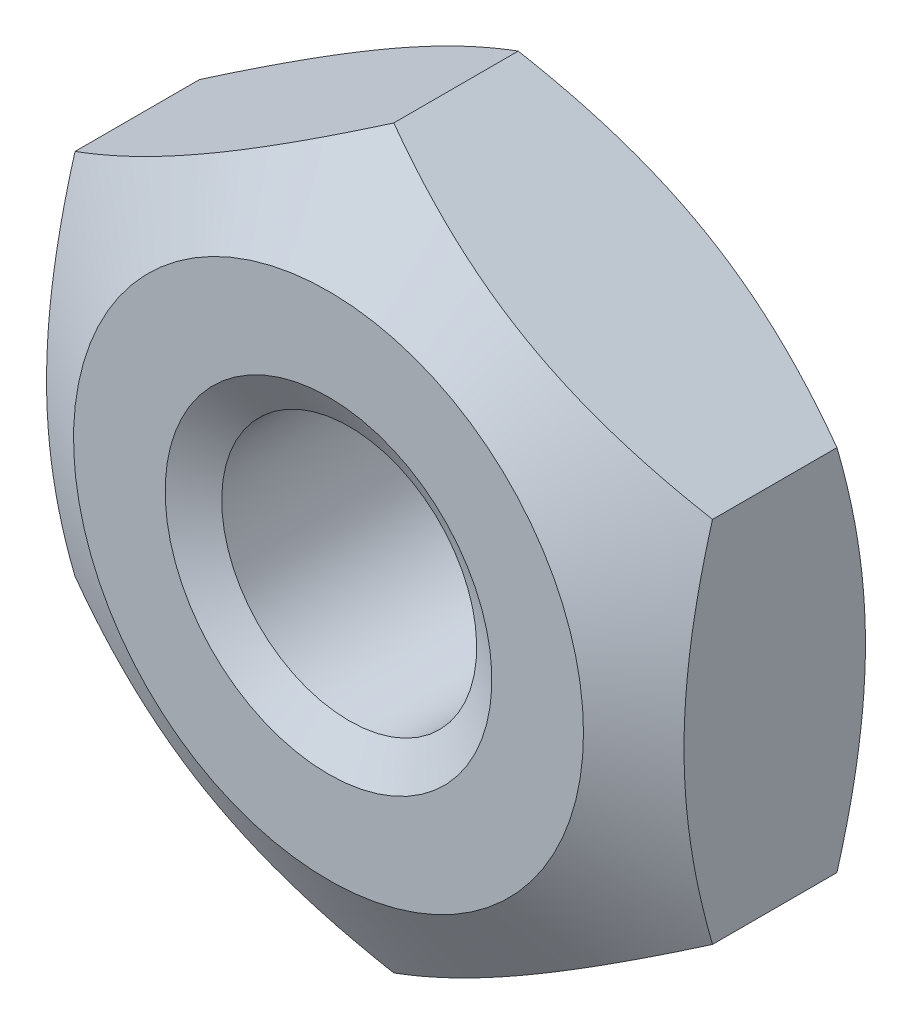
ISO-10303-21;
HEADER;
FILE_DESCRIPTION(('STEP AP214'),'2;1');
FILE_NAME('part.step','',(''),(''),'','','');
FILE_SCHEMA(('AUTOMOTIVE_DESIGN { 1 0 10303 214 1 1 1 1 }'));
ENDSEC;
DATA;
#1=APPLICATION_CONTEXT('core data for automotive mechanical design processes');
#2=APPLICATION_PROTOCOL_DEFINITION('international standard','automotive_design',2000,#1);
#3=PRODUCT_CONTEXT('',#1,'mechanical');
#4=PRODUCT('Part','Part','',(#3));
#5=PRODUCT_RELATED_PRODUCT_CATEGORY('part','',(#4));
#6=PRODUCT_DEFINITION_FORMATION('','',#4);
#7=PRODUCT_DEFINITION_CONTEXT('part definition',#1,'design');
#8=PRODUCT_DEFINITION('design','',#6,#7);
#9=PRODUCT_DEFINITION_SHAPE('','',#8);
#10=(LENGTH_UNIT() NAMED_UNIT(*) SI_UNIT(.MILLI.,.METRE.));
#11=(NAMED_UNIT(*) PLANE_ANGLE_UNIT() SI_UNIT($,.RADIAN.));
#12=(NAMED_UNIT(*) SI_UNIT($,.STERADIAN.) SOLID_ANGLE_UNIT());
#13=UNCERTAINTY_MEASURE_WITH_UNIT(LENGTH_MEASURE(1.E-05),#10,'distance_accuracy_value','');
#14=(GEOMETRIC_REPRESENTATION_CONTEXT(3) GLOBAL_UNCERTAINTY_ASSIGNED_CONTEXT((#13)) GLOBAL_UNIT_ASSIGNED_CONTEXT((#10,
#11,#12)) REPRESENTATION_CONTEXT('',''));
#15=CARTESIAN_POINT('',(0.,0.,0.));
#16=DIRECTION('',(0.,0.,1.));
#17=DIRECTION('',(1.,0.,0.));
#18=AXIS2_PLACEMENT_3D('',#15,#16,#17);
#19=CARTESIAN_POINT('',(0.,0.,0.));
#20=DIRECTION('',(0.,0.,1.));
#21=DIRECTION('',(1.,0.,0.));
#22=AXIS2_PLACEMENT_3D('',#19,#20,#21);
#23=PLANE('',#22);
#24=CARTESIAN_POINT('',(0.,0.,0.));
#25=DIRECTION('',(0.,0.,1.));
#26=DIRECTION('',(0.,-1.,0.));
#27=AXIS2_PLACEMENT_3D('',#24,#25,#26);
#28=CIRCLE('',#27,1.025);
#29=CARTESIAN_POINT('',(0.,-1.025,0.));
#30=VERTEX_POINT('',#29);
#31=EDGE_CURVE('E266',#30,#30,#28,.T.);
#32=ORIENTED_EDGE('',*,*,#31,.F.);
#33=EDGE_LOOP('',(#32));
#34=FACE_BOUND('',#33,.T.);
#35=CARTESIAN_POINT('',(0.,0.,0.));
#36=DIRECTION('',(0.,0.,1.));
#37=DIRECTION('',(1.,0.,0.));
#38=AXIS2_PLACEMENT_3D('',#35,#36,#37);
#39=CIRCLE('',#38,1.6);
#40=CARTESIAN_POINT('',(1.6,0.,0.));
#41=VERTEX_POINT('',#40);
#42=EDGE_CURVE('E225',#41,#41,#39,.T.);
#43=ORIENTED_EDGE('',*,*,#42,.T.);
#44=EDGE_LOOP('',(#43));
#45=FACE_BOUND('',#44,.T.);
#46=ADVANCED_FACE('F38',(#34,#45),#23,.T.);
#47=CARTESIAN_POINT('',(0.,0.,0.));
#48=DIRECTION('',(0.,0.,-1.));
#49=DIRECTION('',(-1.,0.,0.));
#50=AXIS2_PLACEMENT_3D('',#47,#48,#49);
#51=CONICAL_SURFACE('',#50,1.6,1.0471975511966);
#52=CARTESIAN_POINT('',(-2.0002,1.15458506832541,-0.409639574296354));
#53=CARTESIAN_POINT('',(-1.91230873709994,1.20532911262018,-0.380329643776534));
#54=CARTESIAN_POINT('',(-1.82365880552641,1.2565111744778,-0.353672959656322));
#55=CARTESIAN_POINT('',(-1.6448237530022,1.35976164019319,-0.307142598696575));
#56=CARTESIAN_POINT('',(-1.55463545349496,1.41183187919145,-0.287285384058633));
#57=CARTESIAN_POINT('',(-1.37537661423669,1.51532701829183,-0.256373571699106));
#58=CARTESIAN_POINT('',(-1.2863336617737,1.56673599086578,-0.245113259274384));
#59=CARTESIAN_POINT('',(-1.10782860221496,1.66979593505373,-0.231668770270495));
#60=CARTESIAN_POINT('',(-1.01836714429604,1.72144653186531,-0.229473462629321));
#61=CARTESIAN_POINT('',(-0.851191646451202,1.81796535054794,-0.234031097006501));
#62=CARTESIAN_POINT('',(-0.773452629734218,1.86284799277603,-0.239664982362867));
#63=CARTESIAN_POINT('',(-0.618481085463871,1.95232085557724,-0.25752400293668));
#64=CARTESIAN_POINT('',(-0.541249094258807,1.99691076648954,-0.269755243699291));
#65=CARTESIAN_POINT('',(-0.385957813517807,2.08656822922816,-0.30033354454346));
#66=CARTESIAN_POINT('',(-0.307918186892629,2.13162442866766,-0.318810274741566));
#67=CARTESIAN_POINT('',(-0.153003134307877,2.22106467597899,-0.360745625888705));
#68=CARTESIAN_POINT('',(-0.0761257223768926,2.26544987045195,-0.384194388168162));
#69=CARTESIAN_POINT('',(0.000199999999986211,2.30951654681233,-0.409639574296345));
#70=B_SPLINE_CURVE_WITH_KNOTS('',3,(#52,#53,#54,#55,#56,#57,#58,#59,#60,#61,#62,#63,#64,#65,#66,
#67,#68,#69),.UNSPECIFIED.,.F.,.F.,(4,2,2,2,2,2,2,2,4),(0.,0.317031824695611,0.634825876346565,
0.944753967652638,1.25430138000371,1.52387047293094,1.79368946861028,2.06949491027633,
2.34475850821471),.UNSPECIFIED.);
#71=CARTESIAN_POINT('',(-1.99999999999998,1.15470053837927,-0.409572902629929));
#72=VERTEX_POINT('',#71);
#73=CARTESIAN_POINT('',(0.,2.30940107675849,-0.409572902629929));
#74=VERTEX_POINT('',#73);
#75=EDGE_CURVE('E220',#72,#74,#70,.T.);
#76=ORIENTED_EDGE('',*,*,#75,.F.);
#77=CARTESIAN_POINT('',(-2.00000000000001,-3.03052049579594,-1.17258992769246));
#78=CARTESIAN_POINT('',(-2.00000000000001,-2.94372886764183,-1.13077950008363));
#79=CARTESIAN_POINT('',(-2.00000000000001,-2.85673015358734,-1.08939116564908));
#80=CARTESIAN_POINT('',(-2.00000000000001,-2.68220811235262,-1.00769767470967));
#81=CARTESIAN_POINT('',(-2.00000000000001,-2.59468469803299,-0.967392704581887));
#82=CARTESIAN_POINT('',(-2.00000000000001,-2.41851676018472,-0.887886673921365));
#83=CARTESIAN_POINT('',(-2.00000000000001,-2.32986867139882,-0.848693484344967));
#84=CARTESIAN_POINT('',(-2.00000000000001,-2.15184188257194,-0.772009478701173));
#85=CARTESIAN_POINT('',(-2.00000000000001,-2.06246321960079,-0.734518576883523));
#86=CARTESIAN_POINT('',(-2.00000000000001,-1.88025621442632,-0.660646333698944));
#87=CARTESIAN_POINT('',(-2.00000000000001,-1.78740237965157,-0.62432750922274));
#88=CARTESIAN_POINT('',(-2.00000000000001,-1.60058247531122,-0.554614987642539));
#89=CARTESIAN_POINT('',(-2.00000000000001,-1.50661627872517,-0.52122162832672));
#90=CARTESIAN_POINT('',(-2.00000000000001,-1.31762634984156,-0.458290489186248));
#91=CARTESIAN_POINT('',(-2.00000000000001,-1.22260551914203,-0.428744087391374));
#92=CARTESIAN_POINT('',(-2.00000000000001,-1.03119557452282,-0.374497165945702));
#93=CARTESIAN_POINT('',(-2.00000000000001,-0.93480680273185,-0.349795456744497));
#94=CARTESIAN_POINT('',(-2.00000000000001,-0.741128910384957,-0.306597964012984));
#95=CARTESIAN_POINT('',(-2.00000000000001,-0.643846716299778,-0.288071720447721));
#96=CARTESIAN_POINT('',(-2.00000000000001,-0.448151938907581,-0.258320606274393));
#97=CARTESIAN_POINT('',(-2.00000000000001,-0.349739441069647,-0.247095187258078));
#98=CARTESIAN_POINT('',(-2.00000000000001,-0.153525776620674,-0.232991739084162));
#99=CARTESIAN_POINT('',(-2.00000000000001,-0.0557321304576805,-0.230012064962078));
#100=CARTESIAN_POINT('',(-2.,0.13975003167291,-0.232377534118554));
#101=CARTESIAN_POINT('',(-2.,0.237438543103612,-0.237723023291434));
#102=CARTESIAN_POINT('',(-2.,0.476208665170388,-0.260491803794991));
#103=CARTESIAN_POINT('',(-2.,0.616874165871129,-0.282293659147515));
#104=CARTESIAN_POINT('',(-2.,0.895507734114708,-0.339146037610059));
#105=CARTESIAN_POINT('',(-2.,1.03347281625756,-0.374210439011915));
#106=CARTESIAN_POINT('',(-2.,1.30952391328072,-0.454685876034218));
#107=CARTESIAN_POINT('',(-2.,1.44754777586239,-0.500304636329477));
#108=CARTESIAN_POINT('',(-2.,1.7210514616477,-0.598359669184975));
#109=CARTESIAN_POINT('',(-2.,1.85653210717898,-0.650793693068427));
#110=CARTESIAN_POINT('',(-2.,2.16574275602154,-0.77673559227255));
#111=CARTESIAN_POINT('',(-2.,2.3388079813968,-0.851859482740154));
#112=CARTESIAN_POINT('',(-2.,2.6826712350005,-1.0071568330088));
#113=CARTESIAN_POINT('',(-2.,2.85346875200373,-1.08733140878092));
#114=CARTESIAN_POINT('',(-2.,3.1935873828221,-1.25111189286763));
#115=CARTESIAN_POINT('',(-2.,3.36290706964649,-1.33472075031524));
#116=CARTESIAN_POINT('',(-1.99999999999999,3.70037905202038,-1.50426422369798));
#117=CARTESIAN_POINT('',(-1.99999999999999,3.86853131311662,-1.59019890790976));
#118=CARTESIAN_POINT('',(-1.99999999999999,4.19077366360558,-1.75690437473475));
#119=CARTESIAN_POINT('',(-1.99999999999999,4.34492900543288,-1.8375493322588));
#120=CARTESIAN_POINT('',(-1.99999999999999,4.65268017325402,-1.99990916520772));
#121=CARTESIAN_POINT('',(-1.99999999999999,4.80627598293722,-2.0816240715081));
#122=CARTESIAN_POINT('',(-1.99999999999999,5.11269941410369,-2.24569846466231));
#123=CARTESIAN_POINT('',(-1.99999999999999,5.26552797617949,-2.3280561971989));
#124=CARTESIAN_POINT('',(-1.99999999999999,5.5708249923475,-2.49341950889133));
#125=CARTESIAN_POINT('',(-1.99999999999999,5.72329346315724,-2.57642505716979));
#126=CARTESIAN_POINT('',(-1.99999999999999,5.87562805658462,-2.6596739117175));
#127=B_SPLINE_CURVE_WITH_KNOTS('',3,(#77,#78,#79,#80,#81,#82,#83,#84,#85,#86,#87,#88,#89,#90,
#91,#92,#93,#94,#95,#96,#97,#98,#99,#100,#101,#102,#103,#104,#105,#106,#107,#108,#109,#110,#111,
#112,#113,#114,#115,#116,#117,#118,#119,#120,#121,#122,#123,#124,#125,#126),.UNSPECIFIED.,.F.,
.F.,(4,2,2,2,2,2,2,2,2,2,2,2,2,2,2,2,2,2,2,2,2,2,2,2,4),(0.,0.28901616240776,0.578081731674529,
0.868844523215953,1.15959265172095,1.45866666235963,1.75777516012266,2.05620129950673,
2.35455407229876,2.65141268040253,2.94824898711875,3.24140955046669,3.53458229438999,
3.96073507939292,4.38733504165973,4.82317840851069,5.25887833341065,5.82474273611492,
6.39073261058182,6.95721911942851,7.52372227605135,8.04564357517919,8.56757996873426,
9.08839905451368,9.60919346584464),.UNSPECIFIED.);
#128=CARTESIAN_POINT('',(-2.00000000000001,-1.15470053837921,-0.409572902629929));
#129=VERTEX_POINT('',#128);
#130=EDGE_CURVE('E188',#129,#72,#127,.T.);
#131=ORIENTED_EDGE('',*,*,#130,.F.);
#132=CARTESIAN_POINT('',(0.00019999999999125,-2.30951654681236,-0.409639574296361));
#133=CARTESIAN_POINT('',(-0.0876912629000694,-2.25877250251759,-0.380329643776542));
#134=CARTESIAN_POINT('',(-0.176341194473601,-2.20759044065997,-0.35367295965633));
#135=CARTESIAN_POINT('',(-0.355176246997814,-2.10433997494457,-0.307142598696584));
#136=CARTESIAN_POINT('',(-0.445364546505049,-2.05226973594632,-0.287285384058642));
#137=CARTESIAN_POINT('',(-0.62462338576332,-1.94877459684594,-0.256373571699115));
#138=CARTESIAN_POINT('',(-0.713666338226318,-1.89736562427198,-0.245113259274394));
#139=CARTESIAN_POINT('',(-0.892171397785059,-1.79430568008404,-0.231668770270505));
#140=CARTESIAN_POINT('',(-0.981632855703975,-1.74265508327245,-0.229473462629332));
#141=CARTESIAN_POINT('',(-1.14880835354881,-1.64613626458982,-0.234031097006513));
#142=CARTESIAN_POINT('',(-1.2265473702658,-1.60125362236174,-0.239664982362879));
#143=CARTESIAN_POINT('',(-1.38151891453615,-1.51178075956052,-0.257524002936693));
#144=CARTESIAN_POINT('',(-1.45875090574121,-1.46719084864822,-0.269755243699304));
#145=CARTESIAN_POINT('',(-1.61404218648221,-1.37753338590961,-0.300333544543474));
#146=CARTESIAN_POINT('',(-1.69208181310739,-1.3324771864701,-0.31881027474158));
#147=CARTESIAN_POINT('',(-1.84699686569214,-1.24303693915877,-0.360745625888719));
#148=CARTESIAN_POINT('',(-1.92387427762313,-1.19865174468581,-0.384194388168177));
#149=CARTESIAN_POINT('',(-2.00020000000001,-1.15458506832543,-0.409639574296361));
#150=B_SPLINE_CURVE_WITH_KNOTS('',3,(#132,#133,#134,#135,#136,#137,#138,#139,#140,#141,#142,
#143,#144,#145,#146,#147,#148,#149),.UNSPECIFIED.,.F.,.F.,(4,2,2,2,2,2,2,2,4),(0.,
0.317031824695612,0.634825876346569,0.944753967652643,1.25430138000372,1.52387047293095,
1.79368946861029,2.06949491027634,2.34475850821472),.UNSPECIFIED.);
#151=CARTESIAN_POINT('',(0.,-2.30940107675849,-0.409572902629929));
#152=VERTEX_POINT('',#151);
#153=EDGE_CURVE('E180',#152,#129,#150,.T.);
#154=ORIENTED_EDGE('',*,*,#153,.F.);
#155=CARTESIAN_POINT('',(2.00019999999999,-1.15458506832544,-0.409639574296353));
#156=CARTESIAN_POINT('',(1.91230873709993,-1.2053291126202,-0.380329643776534));
#157=CARTESIAN_POINT('',(1.8236588055264,-1.25651117447782,-0.353672959656322));
#158=CARTESIAN_POINT('',(1.64482375300218,-1.35976164019322,-0.307142598696577));
#159=CARTESIAN_POINT('',(1.55463545349495,-1.41183187919147,-0.287285384058635));
#160=CARTESIAN_POINT('',(1.37537661423668,-1.51532701829185,-0.25637357169911));
#161=CARTESIAN_POINT('',(1.28633366177368,-1.5667359908658,-0.245113259274389));
#162=CARTESIAN_POINT('',(1.10782860221494,-1.66979593505375,-0.231668770270501));
#163=CARTESIAN_POINT('',(1.01836714429603,-1.72144653186533,-0.229473462629327));
#164=CARTESIAN_POINT('',(0.851191646451187,-1.81796535054796,-0.234031097006509));
#165=CARTESIAN_POINT('',(0.773452629734202,-1.86284799277605,-0.239664982362876));
#166=CARTESIAN_POINT('',(0.618481085463853,-1.95232085557727,-0.25752400293669));
#167=CARTESIAN_POINT('',(0.541249094258789,-1.99691076648956,-0.269755243699302));
#168=CARTESIAN_POINT('',(0.385957813517788,-2.08656822922818,-0.300333544543473));
#169=CARTESIAN_POINT('',(0.307918186892609,-2.13162442866768,-0.318810274741579));
#170=CARTESIAN_POINT('',(0.153003134307855,-2.22106467597902,-0.360745625888719));
#171=CARTESIAN_POINT('',(0.0761257223768705,-2.26544987045197,-0.384194388168177));
#172=CARTESIAN_POINT('',(-0.000200000000009055,-2.30951654681236,-0.409639574296361));
#173=B_SPLINE_CURVE_WITH_KNOTS('',3,(#155,#156,#157,#158,#159,#160,#161,#162,#163,#164,#165,
#166,#167,#168,#169,#170,#171,#172),.UNSPECIFIED.,.F.,.F.,(4,2,2,2,2,2,2,2,4),(0.,
0.317031824695611,0.634825876346565,0.944753967652637,1.25430138000371,1.52387047293094,
1.79368946861028,2.06949491027633,2.34475850821472),.UNSPECIFIED.);
#174=CARTESIAN_POINT('',(1.99999999999997,-1.15470053837929,-0.409572902629929));
#175=VERTEX_POINT('',#174);
#176=EDGE_CURVE('E96',#175,#152,#173,.T.);
#177=ORIENTED_EDGE('',*,*,#176,.F.);
#178=CARTESIAN_POINT('',(1.99999999999999,-3.030520495734,-1.17258992766261));
#179=CARTESIAN_POINT('',(1.99999999999999,-2.94372886758197,-1.13077950005503));
#180=CARTESIAN_POINT('',(1.99999999999999,-2.85673015352955,-1.08939116562174));
#181=CARTESIAN_POINT('',(1.99999999999999,-2.68220811229899,-1.00769767468485));
#182=CARTESIAN_POINT('',(1.99999999999999,-2.59468469798146,-0.967392704558314));
#183=CARTESIAN_POINT('',(1.99999999999999,-2.41851676013738,-0.8878866739003));
#184=CARTESIAN_POINT('',(1.99999999999999,-2.32986867135361,-0.848693484325156));
#185=CARTESIAN_POINT('',(1.99999999999999,-2.15184188253098,-0.77200947868385));
#186=CARTESIAN_POINT('',(1.99999999999999,-2.06246321956197,-0.734518576867432));
#187=CARTESIAN_POINT('',(1.99999999999999,-1.88025621439191,-0.660646333685336));
#188=CARTESIAN_POINT('',(1.99999999999999,-1.78740237961943,-0.624327509210379));
#189=CARTESIAN_POINT('',(1.99999999999999,-1.60058247528366,-0.554614987632602));
#190=CARTESIAN_POINT('',(1.99999999999999,-1.50661627869992,-0.52122162831796));
#191=CARTESIAN_POINT('',(1.99999999999999,-1.31762634982097,-0.458290489179722));
#192=CARTESIAN_POINT('',(1.99999999999999,-1.2226055191238,-0.428744087385906));
#193=CARTESIAN_POINT('',(1.99999999999999,-1.03119557450936,-0.374497165942165));
#194=CARTESIAN_POINT('',(1.99999999999999,-0.934806802720806,-0.349795456741834));
#195=CARTESIAN_POINT('',(1.99999999999999,-0.741128910380068,-0.30659796401207));
#196=CARTESIAN_POINT('',(1.99999999999999,-0.643846716298643,-0.288071720447606));
#197=CARTESIAN_POINT('',(1.99999999999999,-0.448151938914037,-0.258320606275296));
#198=CARTESIAN_POINT('',(1.99999999999999,-0.349739441079938,-0.247095187259201));
#199=CARTESIAN_POINT('',(1.99999999999999,-0.153525776638568,-0.23299173908505));
#200=CARTESIAN_POINT('',(1.99999999999999,-0.0557321304793417,-0.230012064962521));
#201=CARTESIAN_POINT('',(1.99999999999999,0.139750031643783,-0.232377534117475));
#202=CARTESIAN_POINT('',(1.99999999999999,0.237438543070785,-0.237723023289277));
#203=CARTESIAN_POINT('',(1.99999999999999,0.476208665131639,-0.260491803789862));
#204=CARTESIAN_POINT('',(1.99999999999999,0.616874165830197,-0.282293659140565));
#205=CARTESIAN_POINT('',(1.99999999999999,0.895507734069557,-0.339146037599415));
#206=CARTESIAN_POINT('',(1.99999999999999,1.03347281621038,-0.374210438999399));
#207=CARTESIAN_POINT('',(1.99999999999999,1.30952391322944,-0.454685876017988));
#208=CARTESIAN_POINT('',(1.99999999999999,1.44754777580906,-0.500304636311406));
#209=CARTESIAN_POINT('',(1.99999999999999,1.72105146159028,-0.598359669163334));
#210=CARTESIAN_POINT('',(1.99999999999999,1.85653210711953,-0.650793693045057));
#211=CARTESIAN_POINT('',(1.99999999999999,2.16574275596061,-0.776735592246619));
#212=CARTESIAN_POINT('',(1.99999999999999,2.33880798133635,-0.85185948271357));
#213=CARTESIAN_POINT('',(1.99999999999999,2.68267123494092,-1.00715683298117));
#214=CARTESIAN_POINT('',(1.99999999999999,2.85346875194454,-1.0873314087529));
#215=CARTESIAN_POINT('',(1.99999999999999,3.19358738276363,-1.25111189283899));
#216=CARTESIAN_POINT('',(1.99999999999999,3.36290706958836,-1.33472075028637));
#217=CARTESIAN_POINT('',(1.99999999999999,3.70037905196287,-1.50426422366875));
#218=CARTESIAN_POINT('',(1.99999999999999,3.8685313130594,-1.5901989078804));
#219=CARTESIAN_POINT('',(1.99999999999999,4.19077366354868,-1.75690437470509));
#220=CARTESIAN_POINT('',(1.99999999999999,4.34492900537601,-1.83754933222897));
#221=CARTESIAN_POINT('',(1.99999999999999,4.6526801731972,-1.99990916517757));
#222=CARTESIAN_POINT('',(1.99999999999999,4.80627598288042,-2.08162407147781));
#223=CARTESIAN_POINT('',(1.99999999999999,5.11269941404687,-2.24569846463175));
#224=CARTESIAN_POINT('',(1.99999999999999,5.26552797612264,-2.32805619716821));
#225=CARTESIAN_POINT('',(1.99999999999999,5.57082499229059,-2.4934195088604));
#226=CARTESIAN_POINT('',(1.99999999999999,5.72329346310029,-2.57642505713875));
#227=CARTESIAN_POINT('',(1.99999999999999,5.87562805652763,-2.65967391168635));
#228=B_SPLINE_CURVE_WITH_KNOTS('',3,(#178,#179,#180,#181,#182,#183,#184,#185,#186,#187,#188,
#189,#190,#191,#192,#193,#194,#195,#196,#197,#198,#199,#200,#201,#202,#203,#204,#205,#206,#207,
#208,#209,#210,#211,#212,#213,#214,#215,#216,#217,#218,#219,#220,#221,#222,#223,#224,#225,#226,
#227),.UNSPECIFIED.,.F.,.F.,(4,2,2,2,2,2,2,2,2,2,2,2,2,2,2,2,2,2,2,2,2,2,2,2,4),(0.,
0.289016162400509,0.578081731660025,0.868844523194108,1.15959265169176,1.45866666232274,
1.75777516007806,2.05620129945445,2.3545540722388,2.65141268033109,2.94824898703584,
3.24140955037257,3.53458229428465,3.96073507928028,4.38733504153978,4.82317840838314,
5.25887833327554,5.82474273598035,6.39073261044779,6.95721911929508,7.52372227591852,
8.0456435750462,8.56757996860111,9.08839905438027,9.60919346571097),.UNSPECIFIED.);
#229=CARTESIAN_POINT('',(1.99999999999999,1.15470053837925,-0.409572902629929));
#230=VERTEX_POINT('',#229);
#231=EDGE_CURVE('E92',#230,#175,#228,.F.);
#232=ORIENTED_EDGE('',*,*,#231,.F.);
#233=CARTESIAN_POINT('',(-0.000200000000013959,2.30951654681233,-0.409639574296346));
#234=CARTESIAN_POINT('',(0.087691262900046,2.25877250251756,-0.380329643776527));
#235=CARTESIAN_POINT('',(0.176341194473577,2.20759044065994,-0.353672959656314));
#236=CARTESIAN_POINT('',(0.355176246997787,2.10433997494455,-0.307142598696568));
#237=CARTESIAN_POINT('',(0.445364546505021,2.05226973594629,-0.287285384058625));
#238=CARTESIAN_POINT('',(0.62462338576329,1.94877459684591,-0.256373571699098));
#239=CARTESIAN_POINT('',(0.713666338226288,1.89736562427196,-0.245113259274377));
#240=CARTESIAN_POINT('',(0.892171397785027,1.79430568008402,-0.231668770270487));
#241=CARTESIAN_POINT('',(0.981632855703941,1.74265508327244,-0.229473462629313));
#242=CARTESIAN_POINT('',(1.14880835354878,1.64613626458981,-0.234031097006494));
#243=CARTESIAN_POINT('',(1.22654737026577,1.60125362236172,-0.239664982362859));
#244=CARTESIAN_POINT('',(1.38151891453612,1.5117807595605,-0.257524002936673));
#245=CARTESIAN_POINT('',(1.45875090574118,1.46719084864821,-0.269755243699284));
#246=CARTESIAN_POINT('',(1.61404218648219,1.37753338590959,-0.300333544543455));
#247=CARTESIAN_POINT('',(1.69208181310737,1.33247718647008,-0.318810274741561));
#248=CARTESIAN_POINT('',(1.84699686569212,1.24303693915875,-0.360745625888702));
#249=CARTESIAN_POINT('',(1.92387427762311,1.19865174468579,-0.38419438816816));
#250=CARTESIAN_POINT('',(2.00019999999999,1.15458506832541,-0.409639574296345));
#251=B_SPLINE_CURVE_WITH_KNOTS('',3,(#233,#234,#235,#236,#237,#238,#239,#240,#241,#242,#243,
#244,#245,#246,#247,#248,#249,#250),.UNSPECIFIED.,.F.,.F.,(4,2,2,2,2,2,2,2,4),(0.,
0.317031824695609,0.634825876346561,0.944753967652632,1.25430138000371,1.52387047293093,
1.79368946861028,2.06949491027634,2.34475850821472),.UNSPECIFIED.);
#252=EDGE_CURVE('E64',#74,#230,#251,.T.);
#253=ORIENTED_EDGE('',*,*,#252,.F.);
#254=EDGE_LOOP('',(#76,#131,#154,#177,#232,#253));
#255=FACE_BOUND('',#254,.T.);
#256=ORIENTED_EDGE('',*,*,#42,.F.);
#257=EDGE_LOOP('',(#256));
#258=FACE_BOUND('',#257,.T.);
#259=ADVANCED_FACE('F93',(#255,#258),#51,.T.);
#260=CARTESIAN_POINT('',(1.99999999999999,1.15470053837925,-1.6));
#261=DIRECTION('',(0.499999999999998,0.86602540378444,0.));
#262=DIRECTION('',(-0.86602540378444,0.499999999999998,0.));
#263=AXIS2_PLACEMENT_3D('',#260,#261,#262);
#264=PLANE('',#263);
#265=DIRECTION('',(0.,0.,1.));
#266=VECTOR('',#265,1.);
#267=CARTESIAN_POINT('',(1.99999999999999,1.15470053837925,-1.6));
#268=LINE('',#267,#266);
#269=CARTESIAN_POINT('',(1.99999999999999,1.15470053837925,-1.19042709737007));
#270=VERTEX_POINT('',#269);
#271=EDGE_CURVE('E11',#270,#230,#268,.T.);
#272=ORIENTED_EDGE('',*,*,#271,.F.);
#273=CARTESIAN_POINT('',(2.00019999999999,1.15458506832541,-1.19036042570366));
#274=CARTESIAN_POINT('',(1.91230873709993,1.20532911262017,-1.21967035622347));
#275=CARTESIAN_POINT('',(1.8236588055264,1.25651117447779,-1.24632704034369));
#276=CARTESIAN_POINT('',(1.64482375300219,1.35976164019319,-1.29285740130343));
#277=CARTESIAN_POINT('',(1.55463545349495,1.41183187919144,-1.31271461594138));
#278=CARTESIAN_POINT('',(1.37537661423668,1.51532701829182,-1.3436264283009));
#279=CARTESIAN_POINT('',(1.28633366177369,1.56673599086577,-1.35488674072563));
#280=CARTESIAN_POINT('',(1.10782860221495,1.66979593505372,-1.36833122972951));
#281=CARTESIAN_POINT('',(1.01836714429603,1.7214465318653,-1.37052653737069));
#282=CARTESIAN_POINT('',(0.851191646451192,1.81796535054793,-1.36596890299351));
#283=CARTESIAN_POINT('',(0.773452629734206,1.86284799277602,-1.36033501763714));
#284=CARTESIAN_POINT('',(0.618481085463856,1.95232085557724,-1.34247599706333));
#285=CARTESIAN_POINT('',(0.54124909425879,1.99691076648953,-1.33024475630072));
#286=CARTESIAN_POINT('',(0.385957813517787,2.08656822922815,-1.29966645545655));
#287=CARTESIAN_POINT('',(0.307918186892608,2.13162442866766,-1.28118972525844));
#288=CARTESIAN_POINT('',(0.153003134307852,2.22106467597899,-1.2392543741113));
#289=CARTESIAN_POINT('',(0.0761257223768665,2.26544987045194,-1.21580561183184));
#290=CARTESIAN_POINT('',(-0.000200000000013659,2.30951654681233,-1.19036042570365));
#291=B_SPLINE_CURVE_WITH_KNOTS('',3,(#273,#274,#275,#276,#277,#278,#279,#280,#281,#282,#283,
#284,#285,#286,#287,#288,#289,#290),.UNSPECIFIED.,.F.,.F.,(4,2,2,2,2,2,2,2,4),(0.,
0.317031824695609,0.634825876346562,0.944753967652633,1.25430138000371,1.52387047293093,
1.79368946861028,2.06949491027634,2.34475850821472),.UNSPECIFIED.);
#292=CARTESIAN_POINT('',(0.,2.30940107675849,-1.19042709737007));
#293=VERTEX_POINT('',#292);
#294=EDGE_CURVE('E112',#270,#293,#291,.T.);
#295=ORIENTED_EDGE('',*,*,#294,.T.);
#296=DIRECTION('',(0.,0.,1.));
#297=VECTOR('',#296,1.);
#298=CARTESIAN_POINT('',(0.,2.30940107675849,-1.6));
#299=LINE('',#298,#297);
#300=EDGE_CURVE('E43',#293,#74,#299,.T.);
#301=ORIENTED_EDGE('',*,*,#300,.T.);
#302=ORIENTED_EDGE('',*,*,#252,.T.);
#303=EDGE_LOOP('',(#272,#295,#301,#302));
#304=FACE_BOUND('',#303,.T.);
#305=ADVANCED_FACE('F40',(#304),#264,.T.);
#306=CARTESIAN_POINT('',(1.99999999999999,-1.15470053837927,-1.6));
#307=DIRECTION('',(1.,0.,0.));
#308=DIRECTION('',(0.,0.,-1.));
#309=AXIS2_PLACEMENT_3D('',#306,#307,#308);
#310=PLANE('',#309);
#311=DIRECTION('',(0.,0.,1.));
#312=VECTOR('',#311,1.);
#313=CARTESIAN_POINT('',(1.99999999999999,-1.15470053837927,-1.6));
#314=LINE('',#313,#312);
#315=CARTESIAN_POINT('',(1.99999999999997,-1.15470053837929,-1.19042709737007));
#316=VERTEX_POINT('',#315);
#317=EDGE_CURVE('E48',#316,#175,#314,.T.);
#318=ORIENTED_EDGE('',*,*,#317,.F.);
#319=CARTESIAN_POINT('',(1.99999999999999,-3.030520495734,-0.427410072337384));
#320=CARTESIAN_POINT('',(1.99999999999999,-2.94372886758197,-0.469220499944963));
#321=CARTESIAN_POINT('',(1.99999999999999,-2.85673015352955,-0.510608834378251));
#322=CARTESIAN_POINT('',(1.99999999999999,-2.682208112299,-0.592302325315145));
#323=CARTESIAN_POINT('',(1.99999999999999,-2.59468469798146,-0.63260729544168));
#324=CARTESIAN_POINT('',(1.99999999999999,-2.41851676013738,-0.712113326099695));
#325=CARTESIAN_POINT('',(1.99999999999999,-2.32986867135361,-0.751306515674838));
#326=CARTESIAN_POINT('',(1.99999999999999,-2.15184188253099,-0.827990521316146));
#327=CARTESIAN_POINT('',(1.99999999999999,-2.06246321956197,-0.865481423132564));
#328=CARTESIAN_POINT('',(1.99999999999999,-1.88025621439191,-0.939353666314661));
#329=CARTESIAN_POINT('',(1.99999999999999,-1.78740237961943,-0.975672490789619));
#330=CARTESIAN_POINT('',(1.99999999999999,-1.60058247528366,-1.0453850123674));
#331=CARTESIAN_POINT('',(1.99999999999999,-1.50661627869992,-1.07877837168204));
#332=CARTESIAN_POINT('',(1.99999999999999,-1.31762634982097,-1.14170951082028));
#333=CARTESIAN_POINT('',(1.99999999999999,-1.2226055191238,-1.17125591261409));
#334=CARTESIAN_POINT('',(1.99999999999999,-1.03119557450936,-1.22550283405784));
#335=CARTESIAN_POINT('',(1.99999999999999,-0.934806802720806,-1.25020454325817));
#336=CARTESIAN_POINT('',(1.99999999999999,-0.741128910380068,-1.29340203598793));
#337=CARTESIAN_POINT('',(1.99999999999999,-0.643846716298643,-1.31192827955239));
#338=CARTESIAN_POINT('',(1.99999999999999,-0.448151938914036,-1.34167939372471));
#339=CARTESIAN_POINT('',(1.99999999999999,-0.349739441079937,-1.3529048127408));
#340=CARTESIAN_POINT('',(1.99999999999999,-0.153525776638567,-1.36700826091495));
#341=CARTESIAN_POINT('',(1.99999999999999,-0.0557321304793403,-1.36998793503748));
#342=CARTESIAN_POINT('',(1.99999999999999,0.139750031643784,-1.36762246588253));
#343=CARTESIAN_POINT('',(1.99999999999999,0.237438543070786,-1.36227697671072));
#344=CARTESIAN_POINT('',(1.99999999999999,0.476208665131638,-1.33950819621014));
#345=CARTESIAN_POINT('',(1.99999999999999,0.616874165830195,-1.31770634085944));
#346=CARTESIAN_POINT('',(1.99999999999999,0.895507734069552,-1.26085396240059));
#347=CARTESIAN_POINT('',(1.99999999999999,1.03347281621037,-1.2257895610006));
#348=CARTESIAN_POINT('',(1.99999999999999,1.30952391322943,-1.14531412398201));
#349=CARTESIAN_POINT('',(1.99999999999999,1.44754777580905,-1.0996953636886));
#350=CARTESIAN_POINT('',(1.99999999999999,1.72105146159027,-1.00164033083667));
#351=CARTESIAN_POINT('',(1.99999999999999,1.85653210711951,-0.949206306954947));
#352=CARTESIAN_POINT('',(1.99999999999999,2.16574275596059,-0.823264407753385));
#353=CARTESIAN_POINT('',(1.99999999999999,2.33880798133633,-0.748140517286434));
#354=CARTESIAN_POINT('',(1.99999999999999,2.6826712349409,-0.592843167018835));
#355=CARTESIAN_POINT('',(1.99999999999999,2.85346875194452,-0.512668591247106));
#356=CARTESIAN_POINT('',(1.99999999999999,3.19358738276361,-0.348888107161011));
#357=CARTESIAN_POINT('',(1.99999999999999,3.36290706958834,-0.26527924971363));
#358=CARTESIAN_POINT('',(1.99999999999999,3.70037905196285,-0.0957357763312504));
#359=CARTESIAN_POINT('',(1.99999999999999,3.86853131305938,-0.00980109211959992));
#360=CARTESIAN_POINT('',(1.99999999999999,4.19077366354866,0.156904374705092));
#361=CARTESIAN_POINT('',(1.99999999999999,4.34492900537599,0.237549332228977));
#362=CARTESIAN_POINT('',(1.99999999999999,4.65268017319718,0.399909165177579));
#363=CARTESIAN_POINT('',(1.99999999999999,4.8062759828804,0.481624071477818));
#364=CARTESIAN_POINT('',(1.99999999999999,5.11269941404684,0.645698464631761));
#365=CARTESIAN_POINT('',(1.99999999999999,5.26552797612262,0.728056197168217));
#366=CARTESIAN_POINT('',(1.99999999999999,5.57082499229056,0.89341950886041));
#367=CARTESIAN_POINT('',(1.99999999999999,5.72329346310027,0.976425057138759));
#368=CARTESIAN_POINT('',(1.99999999999999,5.8756280565276,1.05967391168636));
#369=B_SPLINE_CURVE_WITH_KNOTS('',3,(#319,#320,#321,#322,#323,#324,#325,#326,#327,#328,#329,
#330,#331,#332,#333,#334,#335,#336,#337,#338,#339,#340,#341,#342,#343,#344,#345,#346,#347,#348,
#349,#350,#351,#352,#353,#354,#355,#356,#357,#358,#359,#360,#361,#362,#363,#364,#365,#366,#367,
#368),.UNSPECIFIED.,.F.,.F.,(4,2,2,2,2,2,2,2,2,2,2,2,2,2,2,2,2,2,2,2,2,2,2,2,4),(0.,
0.289016162400509,0.578081731660026,0.868844523194109,1.15959265169176,1.45866666232274,
1.75777516007806,2.05620129945446,2.35455407223881,2.65141268033109,2.94824898703585,
3.24140955037257,3.53458229428466,3.96073507928028,4.38733504153978,4.82317840838313,
5.25887833327552,5.82474273598033,6.39073261044778,6.95721911929507,7.52372227591851,
8.04564357504619,8.5675799686011,9.08839905438025,9.60919346571096),.UNSPECIFIED.);
#370=EDGE_CURVE('E110',#316,#270,#369,.T.);
#371=ORIENTED_EDGE('',*,*,#370,.T.);
#372=ORIENTED_EDGE('',*,*,#271,.T.);
#373=ORIENTED_EDGE('',*,*,#231,.T.);
#374=EDGE_LOOP('',(#318,#371,#372,#373));
#375=FACE_BOUND('',#374,.T.);
#376=ADVANCED_FACE('F109',(#375),#310,.T.);
#377=CARTESIAN_POINT('',(0.,-2.30940107675852,-1.6));
#378=DIRECTION('',(0.499999999999999,-0.866025403784439,0.));
#379=DIRECTION('',(0.866025403784439,0.499999999999999,0.));
#380=AXIS2_PLACEMENT_3D('',#377,#378,#379);
#381=PLANE('',#380);
#382=DIRECTION('',(0.,0.,1.));
#383=VECTOR('',#382,1.);
#384=CARTESIAN_POINT('',(0.,-2.30940107675852,-1.6));
#385=LINE('',#384,#383);
#386=CARTESIAN_POINT('',(0.,-2.30940107675849,-1.19042709737007));
#387=VERTEX_POINT('',#386);
#388=EDGE_CURVE('E209',#387,#152,#385,.T.);
#389=ORIENTED_EDGE('',*,*,#388,.F.);
#390=CARTESIAN_POINT('',(-0.000200000000008897,-2.30951654681236,-1.19036042570364));
#391=CARTESIAN_POINT('',(0.0876912629000519,-2.25877250251759,-1.21967035622346));
#392=CARTESIAN_POINT('',(0.176341194473584,-2.20759044065997,-1.24632704034367));
#393=CARTESIAN_POINT('',(0.355176246997796,-2.10433997494458,-1.29285740130342));
#394=CARTESIAN_POINT('',(0.445364546505032,-2.05226973594632,-1.31271461594136));
#395=CARTESIAN_POINT('',(0.624623385763303,-1.94877459684594,-1.34362642830089));
#396=CARTESIAN_POINT('',(0.713666338226302,-1.89736562427198,-1.35488674072561));
#397=CARTESIAN_POINT('',(0.892171397785043,-1.79430568008404,-1.3683312297295));
#398=CARTESIAN_POINT('',(0.981632855703959,-1.74265508327245,-1.37052653737067));
#399=CARTESIAN_POINT('',(1.1488083535488,-1.64613626458983,-1.36596890299349));
#400=CARTESIAN_POINT('',(1.22654737026578,-1.60125362236174,-1.36033501763713));
#401=CARTESIAN_POINT('',(1.38151891453613,-1.51178075956052,-1.34247599706331));
#402=CARTESIAN_POINT('',(1.45875090574119,-1.46719084864823,-1.3302447563007));
#403=CARTESIAN_POINT('',(1.61404218648219,-1.37753338590961,-1.29966645545653));
#404=CARTESIAN_POINT('',(1.69208181310737,-1.33247718647011,-1.28118972525843));
#405=CARTESIAN_POINT('',(1.84699686569212,-1.24303693915877,-1.23925437411129));
#406=CARTESIAN_POINT('',(1.92387427762311,-1.19865174468582,-1.21580561183183));
#407=CARTESIAN_POINT('',(2.00019999999999,-1.15458506832544,-1.19036042570365));
#408=B_SPLINE_CURVE_WITH_KNOTS('',3,(#390,#391,#392,#393,#394,#395,#396,#397,#398,#399,#400,
#401,#402,#403,#404,#405,#406,#407),.UNSPECIFIED.,.F.,.F.,(4,2,2,2,2,2,2,2,4),(0.,
0.317031824695613,0.63482587634657,0.944753967652645,1.25430138000372,1.52387047293095,
1.79368946861029,2.06949491027634,2.34475850821472),.UNSPECIFIED.);
#409=EDGE_CURVE('E113',#387,#316,#408,.T.);
#410=ORIENTED_EDGE('',*,*,#409,.T.);
#411=ORIENTED_EDGE('',*,*,#317,.T.);
#412=ORIENTED_EDGE('',*,*,#176,.T.);
#413=EDGE_LOOP('',(#389,#410,#411,#412));
#414=FACE_BOUND('',#413,.T.);
#415=ADVANCED_FACE('F174',(#414),#381,.T.);
#416=CARTESIAN_POINT('',(-2.00000000000001,-1.15470053837927,-1.6));
#417=DIRECTION('',(-0.5,-0.866025403784438,0.));
#418=DIRECTION('',(0.866025403784438,-0.5,0.));
#419=AXIS2_PLACEMENT_3D('',#416,#417,#418);
#420=PLANE('',#419);
#421=DIRECTION('',(0.,0.,1.));
#422=VECTOR('',#421,1.);
#423=CARTESIAN_POINT('',(-2.00000000000001,-1.15470053837927,-1.6));
#424=LINE('',#423,#422);
#425=CARTESIAN_POINT('',(-2.00000000000001,-1.15470053837921,-1.19042709737007));
#426=VERTEX_POINT('',#425);
#427=EDGE_CURVE('E212',#426,#129,#424,.T.);
#428=ORIENTED_EDGE('',*,*,#427,.F.);
#429=CARTESIAN_POINT('',(-2.00020000000001,-1.15458506832543,-1.19036042570364));
#430=CARTESIAN_POINT('',(-1.91230873709995,-1.20532911262019,-1.21967035622346));
#431=CARTESIAN_POINT('',(-1.82365880552642,-1.25651117447782,-1.24632704034367));
#432=CARTESIAN_POINT('',(-1.6448237530022,-1.35976164019321,-1.29285740130342));
#433=CARTESIAN_POINT('',(-1.55463545349497,-1.41183187919147,-1.31271461594136));
#434=CARTESIAN_POINT('',(-1.3753766142367,-1.51532701829185,-1.34362642830089));
#435=CARTESIAN_POINT('',(-1.2863336617737,-1.5667359908658,-1.35488674072561));
#436=CARTESIAN_POINT('',(-1.10782860221496,-1.66979593505375,-1.3683312297295));
#437=CARTESIAN_POINT('',(-1.01836714429604,-1.72144653186533,-1.37052653737067));
#438=CARTESIAN_POINT('',(-0.851191646451202,-1.81796535054796,-1.36596890299349));
#439=CARTESIAN_POINT('',(-0.773452629734217,-1.86284799277605,-1.36033501763712));
#440=CARTESIAN_POINT('',(-0.618481085463869,-1.95232085557727,-1.34247599706331));
#441=CARTESIAN_POINT('',(-0.541249094258805,-1.99691076648956,-1.3302447563007));
#442=CARTESIAN_POINT('',(-0.385957813517804,-2.08656822922818,-1.29966645545653));
#443=CARTESIAN_POINT('',(-0.307918186892626,-2.13162442866768,-1.28118972525842));
#444=CARTESIAN_POINT('',(-0.153003134307872,-2.22106467597902,-1.23925437411128));
#445=CARTESIAN_POINT('',(-0.0761257223768881,-2.26544987045197,-1.21580561183182));
#446=CARTESIAN_POINT('',(0.000199999999990969,-2.30951654681236,-1.19036042570364));
#447=B_SPLINE_CURVE_WITH_KNOTS('',3,(#429,#430,#431,#432,#433,#434,#435,#436,#437,#438,#439,
#440,#441,#442,#443,#444,#445,#446),.UNSPECIFIED.,.F.,.F.,(4,2,2,2,2,2,2,2,4),(0.,
0.317031824695613,0.63482587634657,0.944753967652644,1.25430138000372,1.52387047293095,
1.79368946861029,2.06949491027634,2.34475850821472),.UNSPECIFIED.);
#448=EDGE_CURVE('E116',#426,#387,#447,.T.);
#449=ORIENTED_EDGE('',*,*,#448,.T.);
#450=ORIENTED_EDGE('',*,*,#388,.T.);
#451=ORIENTED_EDGE('',*,*,#153,.T.);
#452=EDGE_LOOP('',(#428,#449,#450,#451));
#453=FACE_BOUND('',#452,.T.);
#454=ADVANCED_FACE('F170',(#453),#420,.T.);
#455=CARTESIAN_POINT('',(-2.,1.15470053837925,-1.6));
#456=DIRECTION('',(-1.,0.,0.));
#457=DIRECTION('',(0.,-1.,0.));
#458=AXIS2_PLACEMENT_3D('',#455,#456,#457);
#459=PLANE('',#458);
#460=DIRECTION('',(0.,0.,1.));
#461=VECTOR('',#460,1.);
#462=CARTESIAN_POINT('',(-2.,1.15470053837925,-1.6));
#463=LINE('',#462,#461);
#464=CARTESIAN_POINT('',(-2.,1.15470053837925,-1.19042709737006));
#465=VERTEX_POINT('',#464);
#466=EDGE_CURVE('E215',#465,#72,#463,.T.);
#467=ORIENTED_EDGE('',*,*,#466,.F.);
#468=CARTESIAN_POINT('',(-2.00000000000001,-3.03052049579594,-0.427410072307529));
#469=CARTESIAN_POINT('',(-2.00000000000001,-2.94372886764183,-0.469220499916368));
#470=CARTESIAN_POINT('',(-2.00000000000001,-2.85673015358734,-0.510608834350914));
#471=CARTESIAN_POINT('',(-2.00000000000001,-2.68220811235262,-0.59230232529032));
#472=CARTESIAN_POINT('',(-2.00000000000001,-2.59468469803299,-0.632607295418107));
#473=CARTESIAN_POINT('',(-2.00000000000001,-2.41851676018472,-0.71211332607863));
#474=CARTESIAN_POINT('',(-2.00000000000001,-2.32986867139882,-0.751306515655028));
#475=CARTESIAN_POINT('',(-2.00000000000001,-2.15184188257194,-0.827990521298823));
#476=CARTESIAN_POINT('',(-2.00000000000001,-2.06246321960079,-0.865481423116474));
#477=CARTESIAN_POINT('',(-2.00000000000001,-1.88025621442632,-0.939353666301053));
#478=CARTESIAN_POINT('',(-2.00000000000001,-1.78740237965157,-0.975672490777258));
#479=CARTESIAN_POINT('',(-2.00000000000001,-1.60058247531122,-1.04538501235746));
#480=CARTESIAN_POINT('',(-2.00000000000001,-1.50661627872517,-1.07877837167328));
#481=CARTESIAN_POINT('',(-2.00000000000001,-1.31762634984156,-1.14170951081375));
#482=CARTESIAN_POINT('',(-2.00000000000001,-1.22260551914203,-1.17125591260863));
#483=CARTESIAN_POINT('',(-2.00000000000001,-1.03119557452282,-1.2255028340543));
#484=CARTESIAN_POINT('',(-2.00000000000001,-0.93480680273185,-1.2502045432555));
#485=CARTESIAN_POINT('',(-2.00000000000001,-0.741128910384956,-1.29340203598702));
#486=CARTESIAN_POINT('',(-2.00000000000001,-0.643846716299777,-1.31192827955228));
#487=CARTESIAN_POINT('',(-2.00000000000001,-0.44815193890758,-1.34167939372561));
#488=CARTESIAN_POINT('',(-2.00000000000001,-0.349739441069646,-1.35290481274192));
#489=CARTESIAN_POINT('',(-2.00000000000001,-0.153525776620673,-1.36700826091584));
#490=CARTESIAN_POINT('',(-2.00000000000001,-0.055732130457679,-1.36998793503792));
#491=CARTESIAN_POINT('',(-2.,0.139750031672912,-1.36762246588145));
#492=CARTESIAN_POINT('',(-2.,0.237438543103613,-1.36227697670857));
#493=CARTESIAN_POINT('',(-2.,0.476208665170388,-1.33950819620501));
#494=CARTESIAN_POINT('',(-2.,0.616874165871128,-1.31770634085249));
#495=CARTESIAN_POINT('',(-2.,0.895507734114702,-1.26085396238994));
#496=CARTESIAN_POINT('',(-2.,1.03347281625755,-1.22578956098809));
#497=CARTESIAN_POINT('',(-2.,1.30952391328071,-1.14531412396578));
#498=CARTESIAN_POINT('',(-2.,1.44754777586238,-1.09969536367053));
#499=CARTESIAN_POINT('',(-2.,1.72105146164768,-1.00164033081503));
#500=CARTESIAN_POINT('',(-2.,1.85653210717896,-0.949206306931577));
#501=CARTESIAN_POINT('',(-2.,2.16574275602153,-0.823264407727455));
#502=CARTESIAN_POINT('',(-2.,2.33880798139678,-0.74814051725985));
#503=CARTESIAN_POINT('',(-2.,2.68267123500048,-0.592843166991207));
#504=CARTESIAN_POINT('',(-2.,2.85346875200371,-0.512668591219086));
#505=CARTESIAN_POINT('',(-2.,3.19358738282208,-0.348888107132371));
#506=CARTESIAN_POINT('',(-2.,3.36290706964647,-0.265279249684762));
#507=CARTESIAN_POINT('',(-1.99999999999999,3.70037905202035,-0.0957357763020227));
#508=CARTESIAN_POINT('',(-1.99999999999999,3.8685313131166,-0.00980109209024194));
#509=CARTESIAN_POINT('',(-1.99999999999999,4.19077366360556,0.156904374734749));
#510=CARTESIAN_POINT('',(-1.99999999999999,4.34492900543286,0.237549332258808));
#511=CARTESIAN_POINT('',(-1.99999999999999,4.65268017325399,0.399909165207724));
#512=CARTESIAN_POINT('',(-1.99999999999999,4.8062759829372,0.481624071508103));
#513=CARTESIAN_POINT('',(-1.99999999999999,5.11269941410366,0.645698464662317));
#514=CARTESIAN_POINT('',(-1.99999999999999,5.26552797617947,0.728056197198904));
#515=CARTESIAN_POINT('',(-1.99999999999999,5.57082499234748,0.89341950889134));
#516=CARTESIAN_POINT('',(-1.99999999999999,5.72329346315722,0.976425057169801));
#517=CARTESIAN_POINT('',(-1.99999999999999,5.87562805658459,1.05967391171751));
#518=B_SPLINE_CURVE_WITH_KNOTS('',3,(#468,#469,#470,#471,#472,#473,#474,#475,#476,#477,#478,
#479,#480,#481,#482,#483,#484,#485,#486,#487,#488,#489,#490,#491,#492,#493,#494,#495,#496,#497,
#498,#499,#500,#501,#502,#503,#504,#505,#506,#507,#508,#509,#510,#511,#512,#513,#514,#515,#516,
#517),.UNSPECIFIED.,.F.,.F.,(4,2,2,2,2,2,2,2,2,2,2,2,2,2,2,2,2,2,2,2,2,2,2,2,4),(0.,
0.289016162407761,0.578081731674531,0.868844523215955,1.15959265172095,1.45866666235963,
1.75777516012266,2.05620129950674,2.35455407229876,2.65141268040253,2.94824898711875,
3.24140955046669,3.53458229439,3.96073507939292,4.38733504165973,4.82317840851067,
5.25887833341064,5.82474273611491,6.3907326105818,6.95721911942849,7.52372227605133,
8.04564357517918,8.56757996873424,9.08839905451366,9.60919346584463),.UNSPECIFIED.);
#519=EDGE_CURVE('E56',#465,#426,#518,.F.);
#520=ORIENTED_EDGE('',*,*,#519,.T.);
#521=ORIENTED_EDGE('',*,*,#427,.T.);
#522=ORIENTED_EDGE('',*,*,#130,.T.);
#523=EDGE_LOOP('',(#467,#520,#521,#522));
#524=FACE_BOUND('',#523,.T.);
#525=ADVANCED_FACE('F173',(#524),#459,.T.);
#526=CARTESIAN_POINT('',(0.,2.30940107675849,-1.6));
#527=DIRECTION('',(-0.499999999999998,0.86602540378444,0.));
#528=DIRECTION('',(-0.86602540378444,-0.499999999999998,0.));
#529=AXIS2_PLACEMENT_3D('',#526,#527,#528);
#530=PLANE('',#529);
#531=ORIENTED_EDGE('',*,*,#300,.F.);
#532=CARTESIAN_POINT('',(0.000199999999986064,2.30951654681233,-1.19036042570365));
#533=CARTESIAN_POINT('',(-0.0876912629000739,2.25877250251756,-1.21967035622347));
#534=CARTESIAN_POINT('',(-0.176341194473605,2.20759044065994,-1.24632704034369));
#535=CARTESIAN_POINT('',(-0.355176246997816,2.10433997494455,-1.29285740130343));
#536=CARTESIAN_POINT('',(-0.44536454650505,2.05226973594629,-1.31271461594137));
#537=CARTESIAN_POINT('',(-0.624623385763319,1.94877459684591,-1.3436264283009));
#538=CARTESIAN_POINT('',(-0.713666338226317,1.89736562427196,-1.35488674072562));
#539=CARTESIAN_POINT('',(-0.892171397785056,1.79430568008401,-1.36833122972951));
#540=CARTESIAN_POINT('',(-0.981632855703971,1.74265508327243,-1.37052653737068));
#541=CARTESIAN_POINT('',(-1.14880835354881,1.64613626458981,-1.3659689029935));
#542=CARTESIAN_POINT('',(-1.22654737026579,1.60125362236172,-1.36033501763713));
#543=CARTESIAN_POINT('',(-1.38151891453614,1.5117807595605,-1.34247599706332));
#544=CARTESIAN_POINT('',(-1.45875090574121,1.46719084864821,-1.33024475630071));
#545=CARTESIAN_POINT('',(-1.61404218648221,1.37753338590959,-1.29966645545654));
#546=CARTESIAN_POINT('',(-1.69208181310739,1.33247718647009,-1.28118972525843));
#547=CARTESIAN_POINT('',(-1.84699686569214,1.24303693915875,-1.23925437411129));
#548=CARTESIAN_POINT('',(-1.92387427762312,1.1986517446858,-1.21580561183183));
#549=CARTESIAN_POINT('',(-2.0002,1.15458506832541,-1.19036042570365));
#550=B_SPLINE_CURVE_WITH_KNOTS('',3,(#532,#533,#534,#535,#536,#537,#538,#539,#540,#541,#542,
#543,#544,#545,#546,#547,#548,#549),.UNSPECIFIED.,.F.,.F.,(4,2,2,2,2,2,2,2,4),(0.,
0.317031824695609,0.634825876346562,0.944753967652633,1.25430138000371,1.52387047293093,
1.79368946861027,2.06949491027633,2.34475850821471),.UNSPECIFIED.);
#551=EDGE_CURVE('E106',#293,#465,#550,.T.);
#552=ORIENTED_EDGE('',*,*,#551,.T.);
#553=ORIENTED_EDGE('',*,*,#466,.T.);
#554=ORIENTED_EDGE('',*,*,#75,.T.);
#555=EDGE_LOOP('',(#531,#552,#553,#554));
#556=FACE_BOUND('',#555,.T.);
#557=ADVANCED_FACE('F142',(#556),#530,.T.);
#558=CARTESIAN_POINT('',(0.,0.,-1.19042709737007));
#559=DIRECTION('',(0.,0.,1.));
#560=DIRECTION('',(1.,0.,0.));
#561=AXIS2_PLACEMENT_3D('',#558,#559,#560);
#562=CONICAL_SURFACE('',#561,2.30940107675849,1.04719755119659);
#563=CARTESIAN_POINT('',(0.,0.,-1.6));
#564=DIRECTION('',(0.,0.,1.));
#565=DIRECTION('',(1.,0.,0.));
#566=AXIS2_PLACEMENT_3D('',#563,#564,#565);
#567=CIRCLE('',#566,1.6);
#568=CARTESIAN_POINT('',(1.6,0.,-1.6));
#569=VERTEX_POINT('',#568);
#570=EDGE_CURVE('E223',#569,#569,#567,.T.);
#571=ORIENTED_EDGE('',*,*,#570,.T.);
#572=EDGE_LOOP('',(#571));
#573=FACE_BOUND('',#572,.T.);
#574=ORIENTED_EDGE('',*,*,#370,.F.);
#575=ORIENTED_EDGE('',*,*,#409,.F.);
#576=ORIENTED_EDGE('',*,*,#448,.F.);
#577=ORIENTED_EDGE('',*,*,#519,.F.);
#578=ORIENTED_EDGE('',*,*,#551,.F.);
#579=ORIENTED_EDGE('',*,*,#294,.F.);
#580=EDGE_LOOP('',(#574,#575,#576,#577,#578,#579));
#581=FACE_BOUND('',#580,.T.);
#582=ADVANCED_FACE('F136',(#573,#581),#562,.T.);
#583=CARTESIAN_POINT('',(0.,0.,-1.6));
#584=DIRECTION('',(0.,0.,1.));
#585=DIRECTION('',(1.,0.,0.));
#586=AXIS2_PLACEMENT_3D('',#583,#584,#585);
#587=PLANE('',#586);
#588=CARTESIAN_POINT('',(0.,0.,-1.6));
#589=DIRECTION('',(0.,0.,1.));
#590=DIRECTION('',(0.,-1.,0.));
#591=AXIS2_PLACEMENT_3D('',#588,#589,#590);
#592=CIRCLE('',#591,1.025);
#593=CARTESIAN_POINT('',(0.,-1.025,-1.60000000000001));
#594=VERTEX_POINT('',#593);
#595=EDGE_CURVE('E255',#594,#594,#592,.T.);
#596=ORIENTED_EDGE('',*,*,#595,.T.);
#597=EDGE_LOOP('',(#596));
#598=FACE_BOUND('',#597,.T.);
#599=ORIENTED_EDGE('',*,*,#570,.F.);
#600=EDGE_LOOP('',(#599));
#601=FACE_BOUND('',#600,.T.);
#602=ADVANCED_FACE('F141',(#598,#601),#587,.F.);
#603=CARTESIAN_POINT('',(0.,0.,-0.12990381056767));
#604=DIRECTION('',(0.,0.,1.));
#605=DIRECTION('',(0.,-1.,0.));
#606=AXIS2_PLACEMENT_3D('',#603,#604,#605);
#607=CONICAL_SURFACE('',#606,0.800000000000002,1.04719755119659);
#608=ORIENTED_EDGE('',*,*,#31,.T.);
#609=EDGE_LOOP('',(#608));
#610=FACE_BOUND('',#609,.T.);
#611=CARTESIAN_POINT('',(0.,0.,-0.12990381056767));
#612=DIRECTION('',(0.,0.,1.));
#613=DIRECTION('',(0.,-1.,0.));
#614=AXIS2_PLACEMENT_3D('',#611,#612,#613);
#615=CIRCLE('',#614,0.800000000000002);
#616=CARTESIAN_POINT('',(0.,-0.800000000000001,-0.12990381056767));
#617=VERTEX_POINT('',#616);
#618=EDGE_CURVE('E261',#617,#617,#615,.T.);
#619=ORIENTED_EDGE('',*,*,#618,.F.);
#620=EDGE_LOOP('',(#619));
#621=FACE_BOUND('',#620,.T.);
#622=ADVANCED_FACE('F144',(#610,#621),#607,.F.);
#623=CARTESIAN_POINT('',(0.,0.,0.));
#624=DIRECTION('',(0.,0.,1.));
#625=DIRECTION('',(0.,-1.,0.));
#626=AXIS2_PLACEMENT_3D('',#623,#624,#625);
#627=CYLINDRICAL_SURFACE('',#626,0.800000000000001);
#628=ORIENTED_EDGE('',*,*,#618,.T.);
#629=EDGE_LOOP('',(#628));
#630=FACE_BOUND('',#629,.T.);
#631=CARTESIAN_POINT('',(0.,0.,-1.47009618943234));
#632=DIRECTION('',(0.,0.,1.));
#633=DIRECTION('',(0.,-1.,0.));
#634=AXIS2_PLACEMENT_3D('',#631,#632,#633);
#635=CIRCLE('',#634,0.8);
#636=CARTESIAN_POINT('',(0.,-0.799999999999999,-1.47009618943234));
#637=VERTEX_POINT('',#636);
#638=EDGE_CURVE('E258',#637,#637,#635,.T.);
#639=ORIENTED_EDGE('',*,*,#638,.F.);
#640=EDGE_LOOP('',(#639));
#641=FACE_BOUND('',#640,.T.);
#642=ADVANCED_FACE('F250',(#630,#641),#627,.F.);
#643=CARTESIAN_POINT('',(0.,0.,-1.6));
#644=DIRECTION('',(0.,0.,-1.));
#645=DIRECTION('',(0.,1.,0.));
#646=AXIS2_PLACEMENT_3D('',#643,#644,#645);
#647=CONICAL_SURFACE('',#646,1.025,1.04719755119659);
#648=ORIENTED_EDGE('',*,*,#638,.T.);
#649=EDGE_LOOP('',(#648));
#650=FACE_BOUND('',#649,.T.);
#651=ORIENTED_EDGE('',*,*,#595,.F.);
#652=EDGE_LOOP('',(#651));
#653=FACE_BOUND('',#652,.T.);
#654=ADVANCED_FACE('F275',(#650,#653),#647,.F.);
#655=CLOSED_SHELL('',(#46,#259,#305,#376,#415,#454,#525,#557,#582,#602,#622,#642,#654));
#656=MANIFOLD_SOLID_BREP('B2',#655);
#657=ADVANCED_BREP_SHAPE_REPRESENTATION('',(#18,#656),#14);
#658=SHAPE_DEFINITION_REPRESENTATION(#9,#657);
ENDSEC;
END-ISO-10303-21;
